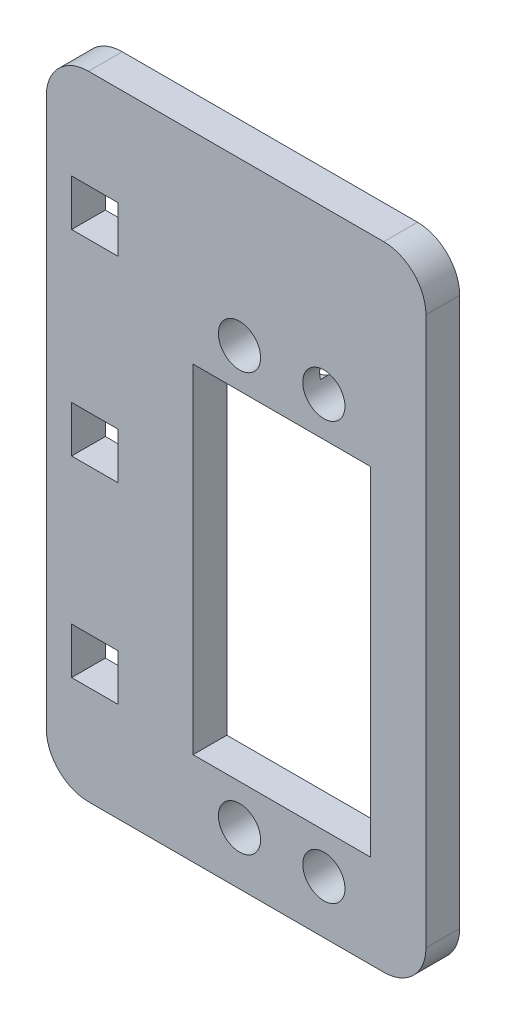
ISO-10303-21;
HEADER;
FILE_DESCRIPTION(('STEP AP214'),'2;1');
FILE_NAME('part.step','',(''),(''),'','','');
FILE_SCHEMA(('AUTOMOTIVE_DESIGN { 1 0 10303 214 1 1 1 1 }'));
ENDSEC;
DATA;
#1=APPLICATION_CONTEXT('core data for automotive mechanical design processes');
#2=APPLICATION_PROTOCOL_DEFINITION('international standard','automotive_design',2000,#1);
#3=PRODUCT_CONTEXT('',#1,'mechanical');
#4=PRODUCT('Part','Part','',(#3));
#5=PRODUCT_RELATED_PRODUCT_CATEGORY('part','',(#4));
#6=PRODUCT_DEFINITION_FORMATION('','',#4);
#7=PRODUCT_DEFINITION_CONTEXT('part definition',#1,'design');
#8=PRODUCT_DEFINITION('design','',#6,#7);
#9=PRODUCT_DEFINITION_SHAPE('','',#8);
#10=(LENGTH_UNIT() NAMED_UNIT(*) SI_UNIT(.MILLI.,.METRE.));
#11=(NAMED_UNIT(*) PLANE_ANGLE_UNIT() SI_UNIT($,.RADIAN.));
#12=(NAMED_UNIT(*) SI_UNIT($,.STERADIAN.) SOLID_ANGLE_UNIT());
#13=UNCERTAINTY_MEASURE_WITH_UNIT(LENGTH_MEASURE(1.E-05),#10,'distance_accuracy_value','');
#14=(GEOMETRIC_REPRESENTATION_CONTEXT(3) GLOBAL_UNCERTAINTY_ASSIGNED_CONTEXT((#13)) GLOBAL_UNIT_ASSIGNED_CONTEXT((#10,
#11,#12)) REPRESENTATION_CONTEXT('',''));
#15=CARTESIAN_POINT('',(0.,0.,0.));
#16=DIRECTION('',(0.,0.,1.));
#17=DIRECTION('',(1.,0.,0.));
#18=AXIS2_PLACEMENT_3D('',#15,#16,#17);
#19=CARTESIAN_POINT('',(0.,0.,0.));
#20=DIRECTION('',(0.,0.,1.));
#21=DIRECTION('',(1.,0.,0.));
#22=AXIS2_PLACEMENT_3D('',#19,#20,#21);
#23=PLANE('',#22);
#24=DIRECTION('',(0.,1.,0.));
#25=VECTOR('',#24,1.);
#26=CARTESIAN_POINT('',(-37.0142435960279,0.,0.));
#27=LINE('',#26,#25);
#28=CARTESIAN_POINT('',(-37.0142435960278,26.6641698890765,0.));
#29=VERTEX_POINT('',#28);
#30=CARTESIAN_POINT('',(-37.0142435960278,32.1641698890765,0.));
#31=VERTEX_POINT('',#30);
#32=EDGE_CURVE('E428',#29,#31,#27,.T.);
#33=ORIENTED_EDGE('',*,*,#32,.T.);
#34=DIRECTION('',(-1.,0.,0.));
#35=VECTOR('',#34,1.);
#36=CARTESIAN_POINT('',(0.,32.1641698890765,0.));
#37=LINE('',#36,#35);
#38=CARTESIAN_POINT('',(-42.5142435960278,32.1641698890765,0.));
#39=VERTEX_POINT('',#38);
#40=EDGE_CURVE('E441',#31,#39,#37,.T.);
#41=ORIENTED_EDGE('',*,*,#40,.T.);
#42=DIRECTION('',(0.,-1.,0.));
#43=VECTOR('',#42,1.);
#44=CARTESIAN_POINT('',(-42.5142435960279,0.,0.));
#45=LINE('',#44,#43);
#46=CARTESIAN_POINT('',(-42.5142435960278,26.6641698890765,0.));
#47=VERTEX_POINT('',#46);
#48=EDGE_CURVE('E453',#39,#47,#45,.T.);
#49=ORIENTED_EDGE('',*,*,#48,.T.);
#50=DIRECTION('',(1.,0.,0.));
#51=VECTOR('',#50,1.);
#52=CARTESIAN_POINT('',(0.,26.6641698890765,0.));
#53=LINE('',#52,#51);
#54=EDGE_CURVE('E452',#47,#29,#53,.T.);
#55=ORIENTED_EDGE('',*,*,#54,.T.);
#56=EDGE_LOOP('',(#33,#41,#49,#55));
#57=FACE_BOUND('',#56,.T.);
#58=DIRECTION('',(0.,1.,0.));
#59=VECTOR('',#58,1.);
#60=CARTESIAN_POINT('',(-42.5142435960278,0.,0.));
#61=LINE('',#60,#59);
#62=CARTESIAN_POINT('',(-42.5142435960278,3.41416988907649,0.));
#63=VERTEX_POINT('',#62);
#64=CARTESIAN_POINT('',(-42.5142435960278,8.91416988907649,0.));
#65=VERTEX_POINT('',#64);
#66=EDGE_CURVE('E411',#63,#65,#61,.T.);
#67=ORIENTED_EDGE('',*,*,#66,.F.);
#68=DIRECTION('',(-1.,0.,0.));
#69=VECTOR('',#68,1.);
#70=CARTESIAN_POINT('',(0.,3.41416988907649,0.));
#71=LINE('',#70,#69);
#72=CARTESIAN_POINT('',(-37.0142435960278,3.41416988907649,0.));
#73=VERTEX_POINT('',#72);
#74=EDGE_CURVE('E416',#73,#63,#71,.T.);
#75=ORIENTED_EDGE('',*,*,#74,.F.);
#76=DIRECTION('',(0.,-1.,0.));
#77=VECTOR('',#76,1.);
#78=CARTESIAN_POINT('',(-37.0142435960278,0.,0.));
#79=LINE('',#78,#77);
#80=CARTESIAN_POINT('',(-37.0142435960278,8.91416988907649,0.));
#81=VERTEX_POINT('',#80);
#82=EDGE_CURVE('E401',#81,#73,#79,.T.);
#83=ORIENTED_EDGE('',*,*,#82,.F.);
#84=DIRECTION('',(1.,0.,0.));
#85=VECTOR('',#84,1.);
#86=CARTESIAN_POINT('',(0.,8.91416988907648,0.));
#87=LINE('',#86,#85);
#88=EDGE_CURVE('E409',#65,#81,#87,.T.);
#89=ORIENTED_EDGE('',*,*,#88,.F.);
#90=EDGE_LOOP('',(#67,#75,#83,#89));
#91=FACE_BOUND('',#90,.T.);
#92=CARTESIAN_POINT('',(-22.6142435960278,-24.8008301109236,0.));
#93=DIRECTION('',(0.,0.,1.));
#94=DIRECTION('',(1.,0.,0.));
#95=AXIS2_PLACEMENT_3D('',#92,#93,#94);
#96=CIRCLE('',#95,2.50000000000002);
#97=CARTESIAN_POINT('',(-20.1142435960278,-24.8008301109236,0.));
#98=VERTEX_POINT('',#97);
#99=EDGE_CURVE('E332',#98,#98,#96,.T.);
#100=ORIENTED_EDGE('',*,*,#99,.T.);
#101=EDGE_LOOP('',(#100));
#102=FACE_BOUND('',#101,.T.);
#103=CARTESIAN_POINT('',(-12.6142435960278,-24.8008301109236,0.));
#104=DIRECTION('',(0.,0.,1.));
#105=DIRECTION('',(1.,0.,0.));
#106=AXIS2_PLACEMENT_3D('',#103,#104,#105);
#107=CIRCLE('',#106,2.50000000000002);
#108=CARTESIAN_POINT('',(-10.1142435960278,-24.8008301109236,0.));
#109=VERTEX_POINT('',#108);
#110=EDGE_CURVE('E328',#109,#109,#107,.T.);
#111=ORIENTED_EDGE('',*,*,#110,.T.);
#112=EDGE_LOOP('',(#111));
#113=FACE_BOUND('',#112,.T.);
#114=DIRECTION('',(0.,-1.,0.));
#115=VECTOR('',#114,1.);
#116=CARTESIAN_POINT('',(-45.5142435960278,43.9141698890765,0.));
#117=LINE('',#116,#115);
#118=CARTESIAN_POINT('',(-45.5142435960278,38.9141698890765,0.));
#119=VERTEX_POINT('',#118);
#120=CARTESIAN_POINT('',(-45.5142435960278,-26.0858301109235,0.));
#121=VERTEX_POINT('',#120);
#122=EDGE_CURVE('E265',#119,#121,#117,.T.);
#123=ORIENTED_EDGE('',*,*,#122,.F.);
#124=CARTESIAN_POINT('',(-40.5142435960278,38.9141698890765,0.));
#125=DIRECTION('',(0.,0.,1.));
#126=DIRECTION('',(1.,0.,0.));
#127=AXIS2_PLACEMENT_3D('',#124,#125,#126);
#128=CIRCLE('',#127,5.);
#129=CARTESIAN_POINT('',(-40.5142435960278,43.9141698890765,0.));
#130=VERTEX_POINT('',#129);
#131=EDGE_CURVE('E288',#119,#130,#128,.F.);
#132=ORIENTED_EDGE('',*,*,#131,.T.);
#133=DIRECTION('',(-1.,0.,0.));
#134=VECTOR('',#133,1.);
#135=CARTESIAN_POINT('',(-30.5142435960278,43.9141698890765,0.));
#136=LINE('',#135,#134);
#137=CARTESIAN_POINT('',(-5.51424359602781,43.9141698890765,0.));
#138=VERTEX_POINT('',#137);
#139=EDGE_CURVE('E274',#138,#130,#136,.T.);
#140=ORIENTED_EDGE('',*,*,#139,.F.);
#141=CARTESIAN_POINT('',(-5.51424359602781,38.9141698890765,0.));
#142=DIRECTION('',(0.,0.,1.));
#143=DIRECTION('',(1.,0.,0.));
#144=AXIS2_PLACEMENT_3D('',#141,#142,#143);
#145=CIRCLE('',#144,5.);
#146=CARTESIAN_POINT('',(-0.514243596027808,38.9141698890765,0.));
#147=VERTEX_POINT('',#146);
#148=EDGE_CURVE('E281',#138,#147,#145,.F.);
#149=ORIENTED_EDGE('',*,*,#148,.T.);
#150=DIRECTION('',(0.,1.,0.));
#151=VECTOR('',#150,1.);
#152=CARTESIAN_POINT('',(-0.514243596027808,-31.0858301109235,0.));
#153=LINE('',#152,#151);
#154=CARTESIAN_POINT('',(-0.514243596027808,-26.0858301109235,0.));
#155=VERTEX_POINT('',#154);
#156=EDGE_CURVE('E273',#155,#147,#153,.T.);
#157=ORIENTED_EDGE('',*,*,#156,.F.);
#158=CARTESIAN_POINT('',(-5.51424359602781,-26.0858301109235,0.));
#159=DIRECTION('',(0.,0.,1.));
#160=DIRECTION('',(1.,0.,0.));
#161=AXIS2_PLACEMENT_3D('',#158,#159,#160);
#162=CIRCLE('',#161,5.);
#163=CARTESIAN_POINT('',(-5.51424359602781,-31.0858301109235,0.));
#164=VERTEX_POINT('',#163);
#165=EDGE_CURVE('E287',#155,#164,#162,.F.);
#166=ORIENTED_EDGE('',*,*,#165,.T.);
#167=DIRECTION('',(1.,0.,0.));
#168=VECTOR('',#167,1.);
#169=CARTESIAN_POINT('',(-30.5142435960278,-31.0858301109235,0.));
#170=LINE('',#169,#168);
#171=CARTESIAN_POINT('',(-40.5142435960278,-31.0858301109235,0.));
#172=VERTEX_POINT('',#171);
#173=EDGE_CURVE('E255',#172,#164,#170,.T.);
#174=ORIENTED_EDGE('',*,*,#173,.F.);
#175=CARTESIAN_POINT('',(-40.5142435960278,-26.0858301109235,0.));
#176=DIRECTION('',(0.,0.,1.));
#177=DIRECTION('',(1.,0.,0.));
#178=AXIS2_PLACEMENT_3D('',#175,#176,#177);
#179=CIRCLE('',#178,5.);
#180=EDGE_CURVE('E289',#172,#121,#179,.F.);
#181=ORIENTED_EDGE('',*,*,#180,.T.);
#182=EDGE_LOOP('',(#123,#132,#140,#149,#157,#166,#174,#181));
#183=FACE_BOUND('',#182,.T.);
#184=DIRECTION('',(1.,0.,0.));
#185=VECTOR('',#184,1.);
#186=CARTESIAN_POINT('',(-7.11424359602785,-20.0508301109236,0.));
#187=LINE('',#186,#185);
#188=CARTESIAN_POINT('',(-28.1142435960282,-20.0508301109236,0.));
#189=VERTEX_POINT('',#188);
#190=CARTESIAN_POINT('',(-7.11424359602785,-20.0508301109236,0.));
#191=VERTEX_POINT('',#190);
#192=EDGE_CURVE('E359',#189,#191,#187,.T.);
#193=ORIENTED_EDGE('',*,*,#192,.T.);
#194=DIRECTION('',(0.,1.,0.));
#195=VECTOR('',#194,1.);
#196=CARTESIAN_POINT('',(-7.11424359602785,-20.0508301109236,0.));
#197=LINE('',#196,#195);
#198=CARTESIAN_POINT('',(-7.11424359602785,20.0491698890765,0.));
#199=VERTEX_POINT('',#198);
#200=EDGE_CURVE('E354',#191,#199,#197,.T.);
#201=ORIENTED_EDGE('',*,*,#200,.T.);
#202=DIRECTION('',(-1.,0.,0.));
#203=VECTOR('',#202,1.);
#204=CARTESIAN_POINT('',(-7.11424359602785,20.0491698890765,0.));
#205=LINE('',#204,#203);
#206=CARTESIAN_POINT('',(-28.1142435960282,20.0491698890764,0.));
#207=VERTEX_POINT('',#206);
#208=EDGE_CURVE('E355',#199,#207,#205,.T.);
#209=ORIENTED_EDGE('',*,*,#208,.T.);
#210=DIRECTION('',(0.,-1.,0.));
#211=VECTOR('',#210,1.);
#212=CARTESIAN_POINT('',(-28.1142435960282,20.0491698890764,0.));
#213=LINE('',#212,#211);
#214=EDGE_CURVE('E348',#207,#189,#213,.T.);
#215=ORIENTED_EDGE('',*,*,#214,.T.);
#216=EDGE_LOOP('',(#193,#201,#209,#215));
#217=FACE_BOUND('',#216,.T.);
#218=DIRECTION('',(0.,-1.,0.));
#219=VECTOR('',#218,1.);
#220=CARTESIAN_POINT('',(-37.0142435960278,0.,0.));
#221=LINE('',#220,#219);
#222=CARTESIAN_POINT('',(-37.0142435960278,-13.8358301109235,0.));
#223=VERTEX_POINT('',#222);
#224=CARTESIAN_POINT('',(-37.0142435960278,-19.3358301109235,0.));
#225=VERTEX_POINT('',#224);
#226=EDGE_CURVE('E433',#223,#225,#221,.T.);
#227=ORIENTED_EDGE('',*,*,#226,.F.);
#228=DIRECTION('',(1.,0.,0.));
#229=VECTOR('',#228,1.);
#230=CARTESIAN_POINT('',(0.,-13.8358301109235,0.));
#231=LINE('',#230,#229);
#232=CARTESIAN_POINT('',(-42.5142435960278,-13.8358301109235,0.));
#233=VERTEX_POINT('',#232);
#234=EDGE_CURVE('E439',#233,#223,#231,.T.);
#235=ORIENTED_EDGE('',*,*,#234,.F.);
#236=DIRECTION('',(0.,1.,0.));
#237=VECTOR('',#236,1.);
#238=CARTESIAN_POINT('',(-42.5142435960278,0.,0.));
#239=LINE('',#238,#237);
#240=CARTESIAN_POINT('',(-42.5142435960278,-19.3358301109235,0.));
#241=VERTEX_POINT('',#240);
#242=EDGE_CURVE('E423',#241,#233,#239,.T.);
#243=ORIENTED_EDGE('',*,*,#242,.F.);
#244=DIRECTION('',(-1.,0.,0.));
#245=VECTOR('',#244,1.);
#246=CARTESIAN_POINT('',(0.,-19.3358301109235,0.));
#247=LINE('',#246,#245);
#248=EDGE_CURVE('E435',#225,#241,#247,.T.);
#249=ORIENTED_EDGE('',*,*,#248,.F.);
#250=EDGE_LOOP('',(#227,#235,#243,#249));
#251=FACE_BOUND('',#250,.T.);
#252=CARTESIAN_POINT('',(-17.6142435960278,25.5041698890765,0.));
#253=DIRECTION('',(0.,0.,-1.));
#254=DIRECTION('',(-1.,0.,0.));
#255=AXIS2_PLACEMENT_3D('',#252,#253,#254);
#256=CIRCLE('',#255,3.);
#257=CARTESIAN_POINT('',(-20.5519572194251,26.1123135126608,0.));
#258=VERTEX_POINT('',#257);
#259=CARTESIAN_POINT('',(-14.6765299726307,26.1123135126616,0.));
#260=VERTEX_POINT('',#259);
#261=EDGE_CURVE('E230',#258,#260,#256,.T.);
#262=ORIENTED_EDGE('',*,*,#261,.F.);
#263=CARTESIAN_POINT('',(-22.6142435960282,24.6991698890764,0.));
#264=DIRECTION('',(0.,0.,1.));
#265=DIRECTION('',(1.,0.,0.));
#266=AXIS2_PLACEMENT_3D('',#263,#264,#265);
#267=CIRCLE('',#266,2.50000000000001);
#268=CARTESIAN_POINT('',(-20.2126336297351,24.0047135766983,0.));
#269=VERTEX_POINT('',#268);
#270=EDGE_CURVE('E236',#258,#269,#267,.T.);
#271=ORIENTED_EDGE('',*,*,#270,.T.);
#272=CARTESIAN_POINT('',(-15.015853562321,24.0047135766976,0.));
#273=VERTEX_POINT('',#272);
#274=EDGE_CURVE('E244',#273,#269,#256,.T.);
#275=ORIENTED_EDGE('',*,*,#274,.F.);
#276=CARTESIAN_POINT('',(-12.6142435960282,24.6991698890765,0.));
#277=DIRECTION('',(0.,0.,1.));
#278=DIRECTION('',(1.,0.,0.));
#279=AXIS2_PLACEMENT_3D('',#276,#277,#278);
#280=CIRCLE('',#279,2.5);
#281=EDGE_CURVE('E242',#273,#260,#280,.T.);
#282=ORIENTED_EDGE('',*,*,#281,.T.);
#283=EDGE_LOOP('',(#262,#271,#275,#282));
#284=FACE_BOUND('',#283,.T.);
#285=ADVANCED_FACE('F39',(#57,#91,#102,#113,#183,#217,#251,#284),#23,.F.);
#286=CARTESIAN_POINT('',(0.,0.,4.));
#287=DIRECTION('',(0.,0.,1.));
#288=DIRECTION('',(1.,0.,0.));
#289=AXIS2_PLACEMENT_3D('',#286,#287,#288);
#290=PLANE('',#289);
#291=DIRECTION('',(-1.,0.,0.));
#292=VECTOR('',#291,1.);
#293=CARTESIAN_POINT('',(0.,-13.8358301109235,4.));
#294=LINE('',#293,#292);
#295=CARTESIAN_POINT('',(-37.0142435960278,-13.8358301109235,4.));
#296=VERTEX_POINT('',#295);
#297=CARTESIAN_POINT('',(-42.5142435960278,-13.8358301109235,4.));
#298=VERTEX_POINT('',#297);
#299=EDGE_CURVE('E362',#296,#298,#294,.T.);
#300=ORIENTED_EDGE('',*,*,#299,.F.);
#301=DIRECTION('',(0.,1.,0.));
#302=VECTOR('',#301,1.);
#303=CARTESIAN_POINT('',(-37.0142435960278,0.,4.));
#304=LINE('',#303,#302);
#305=CARTESIAN_POINT('',(-37.0142435960278,-19.3358301109235,4.));
#306=VERTEX_POINT('',#305);
#307=EDGE_CURVE('E373',#306,#296,#304,.T.);
#308=ORIENTED_EDGE('',*,*,#307,.F.);
#309=DIRECTION('',(1.,0.,0.));
#310=VECTOR('',#309,1.);
#311=CARTESIAN_POINT('',(0.,-19.3358301109235,4.));
#312=LINE('',#311,#310);
#313=CARTESIAN_POINT('',(-42.5142435960278,-19.3358301109235,4.));
#314=VERTEX_POINT('',#313);
#315=EDGE_CURVE('E375',#314,#306,#312,.T.);
#316=ORIENTED_EDGE('',*,*,#315,.F.);
#317=DIRECTION('',(0.,-1.,0.));
#318=VECTOR('',#317,1.);
#319=CARTESIAN_POINT('',(-42.5142435960278,0.,4.));
#320=LINE('',#319,#318);
#321=EDGE_CURVE('E368',#298,#314,#320,.T.);
#322=ORIENTED_EDGE('',*,*,#321,.F.);
#323=EDGE_LOOP('',(#300,#308,#316,#322));
#324=FACE_BOUND('',#323,.T.);
#325=DIRECTION('',(1.,0.,0.));
#326=VECTOR('',#325,1.);
#327=CARTESIAN_POINT('',(0.,3.41416988907649,4.));
#328=LINE('',#327,#326);
#329=CARTESIAN_POINT('',(-42.5142435960278,3.41416988907649,4.));
#330=VERTEX_POINT('',#329);
#331=CARTESIAN_POINT('',(-37.0142435960278,3.41416988907649,4.));
#332=VERTEX_POINT('',#331);
#333=EDGE_CURVE('E386',#330,#332,#328,.T.);
#334=ORIENTED_EDGE('',*,*,#333,.F.);
#335=DIRECTION('',(0.,-1.,0.));
#336=VECTOR('',#335,1.);
#337=CARTESIAN_POINT('',(-42.5142435960278,0.,4.));
#338=LINE('',#337,#336);
#339=CARTESIAN_POINT('',(-42.5142435960278,8.91416988907649,4.));
#340=VERTEX_POINT('',#339);
#341=EDGE_CURVE('E397',#340,#330,#338,.T.);
#342=ORIENTED_EDGE('',*,*,#341,.F.);
#343=DIRECTION('',(-1.,0.,0.));
#344=VECTOR('',#343,1.);
#345=CARTESIAN_POINT('',(0.,8.91416988907648,4.));
#346=LINE('',#345,#344);
#347=CARTESIAN_POINT('',(-37.0142435960278,8.91416988907649,4.));
#348=VERTEX_POINT('',#347);
#349=EDGE_CURVE('E394',#348,#340,#346,.T.);
#350=ORIENTED_EDGE('',*,*,#349,.F.);
#351=DIRECTION('',(0.,1.,0.));
#352=VECTOR('',#351,1.);
#353=CARTESIAN_POINT('',(-37.0142435960278,0.,4.));
#354=LINE('',#353,#352);
#355=EDGE_CURVE('E392',#332,#348,#354,.T.);
#356=ORIENTED_EDGE('',*,*,#355,.F.);
#357=EDGE_LOOP('',(#334,#342,#350,#356));
#358=FACE_BOUND('',#357,.T.);
#359=CARTESIAN_POINT('',(-12.6142435960278,-24.8008301109236,4.));
#360=DIRECTION('',(0.,0.,1.));
#361=DIRECTION('',(1.,0.,0.));
#362=AXIS2_PLACEMENT_3D('',#359,#360,#361);
#363=CIRCLE('',#362,2.50000000000002);
#364=CARTESIAN_POINT('',(-10.1142435960278,-24.8008301109236,4.));
#365=VERTEX_POINT('',#364);
#366=EDGE_CURVE('E321',#365,#365,#363,.T.);
#367=ORIENTED_EDGE('',*,*,#366,.F.);
#368=EDGE_LOOP('',(#367));
#369=FACE_BOUND('',#368,.T.);
#370=CARTESIAN_POINT('',(-22.6142435960282,24.6991698890764,4.));
#371=DIRECTION('',(0.,0.,1.));
#372=DIRECTION('',(1.,0.,0.));
#373=AXIS2_PLACEMENT_3D('',#370,#371,#372);
#374=CIRCLE('',#373,2.50000000000001);
#375=CARTESIAN_POINT('',(-20.1142435960282,24.6991698890764,4.));
#376=VERTEX_POINT('',#375);
#377=EDGE_CURVE('E249',#376,#376,#374,.T.);
#378=ORIENTED_EDGE('',*,*,#377,.F.);
#379=EDGE_LOOP('',(#378));
#380=FACE_BOUND('',#379,.T.);
#381=DIRECTION('',(-1.,0.,0.));
#382=VECTOR('',#381,1.);
#383=CARTESIAN_POINT('',(-0.514243596027808,43.9141698890765,4.));
#384=LINE('',#383,#382);
#385=CARTESIAN_POINT('',(-5.51424359602781,43.9141698890765,4.));
#386=VERTEX_POINT('',#385);
#387=CARTESIAN_POINT('',(-40.5142435960278,43.9141698890765,4.));
#388=VERTEX_POINT('',#387);
#389=EDGE_CURVE('E264',#386,#388,#384,.T.);
#390=ORIENTED_EDGE('',*,*,#389,.T.);
#391=CARTESIAN_POINT('',(-40.5142435960278,38.9141698890765,4.));
#392=DIRECTION('',(0.,0.,1.));
#393=DIRECTION('',(1.,0.,0.));
#394=AXIS2_PLACEMENT_3D('',#391,#392,#393);
#395=CIRCLE('',#394,5.);
#396=CARTESIAN_POINT('',(-45.5142435960278,38.9141698890765,4.));
#397=VERTEX_POINT('',#396);
#398=EDGE_CURVE('E301',#388,#397,#395,.T.);
#399=ORIENTED_EDGE('',*,*,#398,.T.);
#400=DIRECTION('',(0.,-1.,0.));
#401=VECTOR('',#400,1.);
#402=CARTESIAN_POINT('',(-45.5142435960278,43.9141698890765,4.));
#403=LINE('',#402,#401);
#404=CARTESIAN_POINT('',(-45.5142435960278,-26.0858301109235,4.));
#405=VERTEX_POINT('',#404);
#406=EDGE_CURVE('E270',#397,#405,#403,.T.);
#407=ORIENTED_EDGE('',*,*,#406,.T.);
#408=CARTESIAN_POINT('',(-40.5142435960278,-26.0858301109235,4.));
#409=DIRECTION('',(0.,0.,1.));
#410=DIRECTION('',(1.,0.,0.));
#411=AXIS2_PLACEMENT_3D('',#408,#409,#410);
#412=CIRCLE('',#411,5.);
#413=CARTESIAN_POINT('',(-40.5142435960278,-31.0858301109235,4.));
#414=VERTEX_POINT('',#413);
#415=EDGE_CURVE('E303',#405,#414,#412,.T.);
#416=ORIENTED_EDGE('',*,*,#415,.T.);
#417=DIRECTION('',(1.,0.,0.));
#418=VECTOR('',#417,1.);
#419=CARTESIAN_POINT('',(-30.5142435960278,-31.0858301109235,4.));
#420=LINE('',#419,#418);
#421=CARTESIAN_POINT('',(-5.51424359602781,-31.0858301109235,4.));
#422=VERTEX_POINT('',#421);
#423=EDGE_CURVE('E256',#414,#422,#420,.T.);
#424=ORIENTED_EDGE('',*,*,#423,.T.);
#425=CARTESIAN_POINT('',(-5.51424359602781,-26.0858301109235,4.));
#426=DIRECTION('',(0.,0.,1.));
#427=DIRECTION('',(1.,0.,0.));
#428=AXIS2_PLACEMENT_3D('',#425,#426,#427);
#429=CIRCLE('',#428,5.);
#430=CARTESIAN_POINT('',(-0.514243596027808,-26.0858301109235,4.));
#431=VERTEX_POINT('',#430);
#432=EDGE_CURVE('E296',#422,#431,#429,.T.);
#433=ORIENTED_EDGE('',*,*,#432,.T.);
#434=DIRECTION('',(0.,1.,0.));
#435=VECTOR('',#434,1.);
#436=CARTESIAN_POINT('',(-0.514243596027808,-31.0858301109235,4.));
#437=LINE('',#436,#435);
#438=CARTESIAN_POINT('',(-0.514243596027808,38.9141698890765,4.));
#439=VERTEX_POINT('',#438);
#440=EDGE_CURVE('E263',#431,#439,#437,.T.);
#441=ORIENTED_EDGE('',*,*,#440,.T.);
#442=CARTESIAN_POINT('',(-5.51424359602781,38.9141698890765,4.));
#443=DIRECTION('',(0.,0.,1.));
#444=DIRECTION('',(1.,0.,0.));
#445=AXIS2_PLACEMENT_3D('',#442,#443,#444);
#446=CIRCLE('',#445,5.);
#447=EDGE_CURVE('E300',#439,#386,#446,.T.);
#448=ORIENTED_EDGE('',*,*,#447,.T.);
#449=EDGE_LOOP('',(#390,#399,#407,#416,#424,#433,#441,#448));
#450=FACE_BOUND('',#449,.T.);
#451=CARTESIAN_POINT('',(-12.6142435960282,24.6991698890765,4.));
#452=DIRECTION('',(0.,0.,1.));
#453=DIRECTION('',(1.,0.,0.));
#454=AXIS2_PLACEMENT_3D('',#451,#452,#453);
#455=CIRCLE('',#454,2.5);
#456=CARTESIAN_POINT('',(-10.1142435960282,24.6991698890765,4.));
#457=VERTEX_POINT('',#456);
#458=EDGE_CURVE('E246',#457,#457,#455,.T.);
#459=ORIENTED_EDGE('',*,*,#458,.F.);
#460=EDGE_LOOP('',(#459));
#461=FACE_BOUND('',#460,.T.);
#462=CARTESIAN_POINT('',(-22.6142435960278,-24.8008301109236,4.));
#463=DIRECTION('',(0.,0.,1.));
#464=DIRECTION('',(1.,0.,0.));
#465=AXIS2_PLACEMENT_3D('',#462,#463,#464);
#466=CIRCLE('',#465,2.50000000000002);
#467=CARTESIAN_POINT('',(-20.1142435960278,-24.8008301109236,4.));
#468=VERTEX_POINT('',#467);
#469=EDGE_CURVE('E329',#468,#468,#466,.T.);
#470=ORIENTED_EDGE('',*,*,#469,.F.);
#471=EDGE_LOOP('',(#470));
#472=FACE_BOUND('',#471,.T.);
#473=DIRECTION('',(0.,1.,0.));
#474=VECTOR('',#473,1.);
#475=CARTESIAN_POINT('',(-7.11424359602785,-20.0508301109236,4.));
#476=LINE('',#475,#474);
#477=CARTESIAN_POINT('',(-7.11424359602785,-20.0508301109236,4.));
#478=VERTEX_POINT('',#477);
#479=CARTESIAN_POINT('',(-7.11424359602785,20.0491698890765,4.));
#480=VERTEX_POINT('',#479);
#481=EDGE_CURVE('E367',#478,#480,#476,.T.);
#482=ORIENTED_EDGE('',*,*,#481,.F.);
#483=DIRECTION('',(1.,0.,0.));
#484=VECTOR('',#483,1.);
#485=CARTESIAN_POINT('',(-7.11424359602785,-20.0508301109236,4.));
#486=LINE('',#485,#484);
#487=CARTESIAN_POINT('',(-28.1142435960282,-20.0508301109236,4.));
#488=VERTEX_POINT('',#487);
#489=EDGE_CURVE('E351',#488,#478,#486,.T.);
#490=ORIENTED_EDGE('',*,*,#489,.F.);
#491=DIRECTION('',(0.,-1.,0.));
#492=VECTOR('',#491,1.);
#493=CARTESIAN_POINT('',(-28.1142435960282,20.0491698890764,4.));
#494=LINE('',#493,#492);
#495=CARTESIAN_POINT('',(-28.1142435960282,20.0491698890764,4.));
#496=VERTEX_POINT('',#495);
#497=EDGE_CURVE('E350',#496,#488,#494,.T.);
#498=ORIENTED_EDGE('',*,*,#497,.F.);
#499=DIRECTION('',(-1.,0.,0.));
#500=VECTOR('',#499,1.);
#501=CARTESIAN_POINT('',(-7.11424359602785,20.0491698890765,4.));
#502=LINE('',#501,#500);
#503=EDGE_CURVE('E364',#480,#496,#502,.T.);
#504=ORIENTED_EDGE('',*,*,#503,.F.);
#505=EDGE_LOOP('',(#482,#490,#498,#504));
#506=FACE_BOUND('',#505,.T.);
#507=DIRECTION('',(1.,0.,0.));
#508=VECTOR('',#507,1.);
#509=CARTESIAN_POINT('',(0.,32.1641698890765,4.));
#510=LINE('',#509,#508);
#511=CARTESIAN_POINT('',(-42.5142435960278,32.1641698890765,4.));
#512=VERTEX_POINT('',#511);
#513=CARTESIAN_POINT('',(-37.0142435960278,32.1641698890765,4.));
#514=VERTEX_POINT('',#513);
#515=EDGE_CURVE('E379',#512,#514,#510,.T.);
#516=ORIENTED_EDGE('',*,*,#515,.T.);
#517=DIRECTION('',(0.,-1.,0.));
#518=VECTOR('',#517,1.);
#519=CARTESIAN_POINT('',(-37.0142435960279,0.,4.));
#520=LINE('',#519,#518);
#521=CARTESIAN_POINT('',(-37.0142435960278,26.6641698890765,4.));
#522=VERTEX_POINT('',#521);
#523=EDGE_CURVE('E380',#514,#522,#520,.T.);
#524=ORIENTED_EDGE('',*,*,#523,.T.);
#525=DIRECTION('',(-1.,0.,0.));
#526=VECTOR('',#525,1.);
#527=CARTESIAN_POINT('',(0.,26.6641698890765,4.));
#528=LINE('',#527,#526);
#529=CARTESIAN_POINT('',(-42.5142435960278,26.6641698890765,4.));
#530=VERTEX_POINT('',#529);
#531=EDGE_CURVE('E387',#522,#530,#528,.T.);
#532=ORIENTED_EDGE('',*,*,#531,.T.);
#533=DIRECTION('',(0.,1.,0.));
#534=VECTOR('',#533,1.);
#535=CARTESIAN_POINT('',(-42.5142435960279,0.,4.));
#536=LINE('',#535,#534);
#537=EDGE_CURVE('E381',#530,#512,#536,.T.);
#538=ORIENTED_EDGE('',*,*,#537,.T.);
#539=EDGE_LOOP('',(#516,#524,#532,#538));
#540=FACE_BOUND('',#539,.T.);
#541=ADVANCED_FACE('F466',(#324,#358,#369,#380,#450,#461,#472,#506,#540),#290,.T.);
#542=CARTESIAN_POINT('',(-30.5142435960278,-31.0858301109235,4.));
#543=DIRECTION('',(0.,1.,0.));
#544=DIRECTION('',(-1.,0.,0.));
#545=AXIS2_PLACEMENT_3D('',#542,#543,#544);
#546=PLANE('',#545);
#547=ORIENTED_EDGE('',*,*,#423,.F.);
#548=DIRECTION('',(0.,0.,-1.));
#549=VECTOR('',#548,1.);
#550=CARTESIAN_POINT('',(-40.5142435960278,-31.0858301109235,4.));
#551=LINE('',#550,#549);
#552=EDGE_CURVE('E310',#414,#172,#551,.T.);
#553=ORIENTED_EDGE('',*,*,#552,.T.);
#554=ORIENTED_EDGE('',*,*,#173,.T.);
#555=DIRECTION('',(0.,0.,-1.));
#556=VECTOR('',#555,1.);
#557=CARTESIAN_POINT('',(-5.51424359602781,-31.0858301109235,4.));
#558=LINE('',#557,#556);
#559=EDGE_CURVE('E304',#164,#422,#558,.F.);
#560=ORIENTED_EDGE('',*,*,#559,.T.);
#561=EDGE_LOOP('',(#547,#553,#554,#560));
#562=FACE_BOUND('',#561,.T.);
#563=ADVANCED_FACE('F480',(#562),#546,.F.);
#564=CARTESIAN_POINT('',(-0.514243596027808,-31.0858301109235,4.));
#565=DIRECTION('',(-1.,0.,0.));
#566=DIRECTION('',(0.,0.,1.));
#567=AXIS2_PLACEMENT_3D('',#564,#565,#566);
#568=PLANE('',#567);
#569=ORIENTED_EDGE('',*,*,#440,.F.);
#570=DIRECTION('',(0.,0.,-1.));
#571=VECTOR('',#570,1.);
#572=CARTESIAN_POINT('',(-0.514243596027808,-26.0858301109235,4.));
#573=LINE('',#572,#571);
#574=EDGE_CURVE('E312',#431,#155,#573,.T.);
#575=ORIENTED_EDGE('',*,*,#574,.T.);
#576=ORIENTED_EDGE('',*,*,#156,.T.);
#577=DIRECTION('',(0.,0.,-1.));
#578=VECTOR('',#577,1.);
#579=CARTESIAN_POINT('',(-0.514243596027808,38.9141698890765,4.));
#580=LINE('',#579,#578);
#581=EDGE_CURVE('E62',#147,#439,#580,.F.);
#582=ORIENTED_EDGE('',*,*,#581,.T.);
#583=EDGE_LOOP('',(#569,#575,#576,#582));
#584=FACE_BOUND('',#583,.T.);
#585=ADVANCED_FACE('F487',(#584),#568,.F.);
#586=CARTESIAN_POINT('',(-30.5142435960278,43.9141698890765,4.));
#587=DIRECTION('',(0.,-1.,0.));
#588=DIRECTION('',(0.,0.,-1.));
#589=AXIS2_PLACEMENT_3D('',#586,#587,#588);
#590=PLANE('',#589);
#591=ORIENTED_EDGE('',*,*,#139,.T.);
#592=DIRECTION('',(0.,0.,-1.));
#593=VECTOR('',#592,1.);
#594=CARTESIAN_POINT('',(-40.5142435960278,43.9141698890765,4.));
#595=LINE('',#594,#593);
#596=EDGE_CURVE('E293',#130,#388,#595,.F.);
#597=ORIENTED_EDGE('',*,*,#596,.T.);
#598=ORIENTED_EDGE('',*,*,#389,.F.);
#599=DIRECTION('',(0.,0.,-1.));
#600=VECTOR('',#599,1.);
#601=CARTESIAN_POINT('',(-5.51424359602781,43.9141698890765,4.));
#602=LINE('',#601,#600);
#603=EDGE_CURVE('E295',#386,#138,#602,.T.);
#604=ORIENTED_EDGE('',*,*,#603,.T.);
#605=EDGE_LOOP('',(#591,#597,#598,#604));
#606=FACE_BOUND('',#605,.T.);
#607=ADVANCED_FACE('F488',(#606),#590,.F.);
#608=CARTESIAN_POINT('',(-45.5142435960278,43.9141698890765,4.));
#609=DIRECTION('',(1.,0.,0.));
#610=DIRECTION('',(0.,1.,0.));
#611=AXIS2_PLACEMENT_3D('',#608,#609,#610);
#612=PLANE('',#611);
#613=ORIENTED_EDGE('',*,*,#406,.F.);
#614=DIRECTION('',(0.,0.,-1.));
#615=VECTOR('',#614,1.);
#616=CARTESIAN_POINT('',(-45.5142435960278,38.9141698890765,4.));
#617=LINE('',#616,#615);
#618=EDGE_CURVE('E282',#397,#119,#617,.T.);
#619=ORIENTED_EDGE('',*,*,#618,.T.);
#620=ORIENTED_EDGE('',*,*,#122,.T.);
#621=DIRECTION('',(0.,0.,-1.));
#622=VECTOR('',#621,1.);
#623=CARTESIAN_POINT('',(-45.5142435960278,-26.0858301109235,4.));
#624=LINE('',#623,#622);
#625=EDGE_CURVE('E269',#121,#405,#624,.F.);
#626=ORIENTED_EDGE('',*,*,#625,.T.);
#627=EDGE_LOOP('',(#613,#619,#620,#626));
#628=FACE_BOUND('',#627,.T.);
#629=ADVANCED_FACE('F481',(#628),#612,.F.);
#630=CARTESIAN_POINT('',(-22.6142435960282,24.6991698890764,4.));
#631=DIRECTION('',(0.,0.,-1.));
#632=DIRECTION('',(-1.,0.,0.));
#633=AXIS2_PLACEMENT_3D('',#630,#631,#632);
#634=CYLINDRICAL_SURFACE('',#633,2.50000000000001);
#635=DIRECTION('',(0.,0.,-1.));
#636=VECTOR('',#635,1.);
#637=CARTESIAN_POINT('',(-20.2126336297351,24.0047135766983,1.));
#638=LINE('',#637,#636);
#639=CARTESIAN_POINT('',(-20.2126336297351,24.0047135766983,2.));
#640=VERTEX_POINT('',#639);
#641=EDGE_CURVE('E235',#269,#640,#638,.F.);
#642=ORIENTED_EDGE('',*,*,#641,.F.);
#643=ORIENTED_EDGE('',*,*,#270,.F.);
#644=DIRECTION('',(0.,0.,-1.));
#645=VECTOR('',#644,1.);
#646=CARTESIAN_POINT('',(-20.5519572194251,26.1123135126608,1.));
#647=LINE('',#646,#645);
#648=CARTESIAN_POINT('',(-20.5519572194251,26.1123135126608,2.));
#649=VERTEX_POINT('',#648);
#650=EDGE_CURVE('E221',#649,#258,#647,.T.);
#651=ORIENTED_EDGE('',*,*,#650,.F.);
#652=CARTESIAN_POINT('',(-22.6142435960282,24.6991698890764,2.));
#653=DIRECTION('',(0.,0.,-1.));
#654=DIRECTION('',(-1.,0.,0.));
#655=AXIS2_PLACEMENT_3D('',#652,#653,#654);
#656=CIRCLE('',#655,2.50000000000001);
#657=EDGE_CURVE('E231',#649,#640,#656,.T.);
#658=ORIENTED_EDGE('',*,*,#657,.T.);
#659=EDGE_LOOP('',(#642,#643,#651,#658));
#660=FACE_BOUND('',#659,.T.);
#661=ORIENTED_EDGE('',*,*,#377,.T.);
#662=EDGE_LOOP('',(#661));
#663=FACE_BOUND('',#662,.T.);
#664=ADVANCED_FACE('F247',(#660,#663),#634,.F.);
#665=CARTESIAN_POINT('',(-12.6142435960282,24.6991698890765,4.));
#666=DIRECTION('',(0.,0.,-1.));
#667=DIRECTION('',(-1.,0.,0.));
#668=AXIS2_PLACEMENT_3D('',#665,#666,#667);
#669=CYLINDRICAL_SURFACE('',#668,2.5);
#670=DIRECTION('',(0.,0.,-1.));
#671=VECTOR('',#670,1.);
#672=CARTESIAN_POINT('',(-14.6765299726307,26.1123135126616,1.));
#673=LINE('',#672,#671);
#674=CARTESIAN_POINT('',(-14.6765299726307,26.1123135126616,2.));
#675=VERTEX_POINT('',#674);
#676=EDGE_CURVE('E11',#260,#675,#673,.F.);
#677=ORIENTED_EDGE('',*,*,#676,.F.);
#678=ORIENTED_EDGE('',*,*,#281,.F.);
#679=DIRECTION('',(0.,0.,-1.));
#680=VECTOR('',#679,1.);
#681=CARTESIAN_POINT('',(-15.015853562321,24.0047135766976,1.));
#682=LINE('',#681,#680);
#683=CARTESIAN_POINT('',(-15.015853562321,24.0047135766976,2.));
#684=VERTEX_POINT('',#683);
#685=EDGE_CURVE('E50',#684,#273,#682,.T.);
#686=ORIENTED_EDGE('',*,*,#685,.F.);
#687=CARTESIAN_POINT('',(-12.6142435960282,24.6991698890765,2.));
#688=DIRECTION('',(0.,0.,-1.));
#689=DIRECTION('',(-1.,0.,0.));
#690=AXIS2_PLACEMENT_3D('',#687,#688,#689);
#691=CIRCLE('',#690,2.5);
#692=EDGE_CURVE('E311',#684,#675,#691,.T.);
#693=ORIENTED_EDGE('',*,*,#692,.T.);
#694=EDGE_LOOP('',(#677,#678,#686,#693));
#695=FACE_BOUND('',#694,.T.);
#696=ORIENTED_EDGE('',*,*,#458,.T.);
#697=EDGE_LOOP('',(#696));
#698=FACE_BOUND('',#697,.T.);
#699=ADVANCED_FACE('F325',(#695,#698),#669,.F.);
#700=CARTESIAN_POINT('',(-12.6142435960278,-24.8008301109236,4.));
#701=DIRECTION('',(0.,0.,-1.));
#702=DIRECTION('',(-1.,0.,0.));
#703=AXIS2_PLACEMENT_3D('',#700,#701,#702);
#704=CYLINDRICAL_SURFACE('',#703,2.50000000000002);
#705=ORIENTED_EDGE('',*,*,#366,.T.);
#706=EDGE_LOOP('',(#705));
#707=FACE_BOUND('',#706,.T.);
#708=ORIENTED_EDGE('',*,*,#110,.F.);
#709=EDGE_LOOP('',(#708));
#710=FACE_BOUND('',#709,.T.);
#711=ADVANCED_FACE('F605',(#707,#710),#704,.F.);
#712=CARTESIAN_POINT('',(-22.6142435960278,-24.8008301109236,4.));
#713=DIRECTION('',(0.,0.,-1.));
#714=DIRECTION('',(-1.,0.,0.));
#715=AXIS2_PLACEMENT_3D('',#712,#713,#714);
#716=CYLINDRICAL_SURFACE('',#715,2.50000000000002);
#717=ORIENTED_EDGE('',*,*,#469,.T.);
#718=EDGE_LOOP('',(#717));
#719=FACE_BOUND('',#718,.T.);
#720=ORIENTED_EDGE('',*,*,#99,.F.);
#721=EDGE_LOOP('',(#720));
#722=FACE_BOUND('',#721,.T.);
#723=ADVANCED_FACE('F599',(#719,#722),#716,.F.);
#724=CARTESIAN_POINT('',(-7.11424359602785,-20.0508301109236,4.));
#725=DIRECTION('',(0.,1.,0.));
#726=DIRECTION('',(-1.,0.,0.));
#727=AXIS2_PLACEMENT_3D('',#724,#725,#726);
#728=PLANE('',#727);
#729=ORIENTED_EDGE('',*,*,#192,.F.);
#730=DIRECTION('',(0.,0.,-1.));
#731=VECTOR('',#730,1.);
#732=CARTESIAN_POINT('',(-28.1142435960282,-20.0508301109236,4.));
#733=LINE('',#732,#731);
#734=EDGE_CURVE('E342',#488,#189,#733,.T.);
#735=ORIENTED_EDGE('',*,*,#734,.F.);
#736=ORIENTED_EDGE('',*,*,#489,.T.);
#737=DIRECTION('',(0.,0.,-1.));
#738=VECTOR('',#737,1.);
#739=CARTESIAN_POINT('',(-7.11424359602785,-20.0508301109236,4.));
#740=LINE('',#739,#738);
#741=EDGE_CURVE('E334',#478,#191,#740,.T.);
#742=ORIENTED_EDGE('',*,*,#741,.T.);
#743=EDGE_LOOP('',(#729,#735,#736,#742));
#744=FACE_BOUND('',#743,.T.);
#745=ADVANCED_FACE('F591',(#744),#728,.T.);
#746=CARTESIAN_POINT('',(-7.11424359602785,-20.0508301109236,4.));
#747=DIRECTION('',(-1.,0.,0.));
#748=DIRECTION('',(0.,0.,1.));
#749=AXIS2_PLACEMENT_3D('',#746,#747,#748);
#750=PLANE('',#749);
#751=ORIENTED_EDGE('',*,*,#200,.F.);
#752=ORIENTED_EDGE('',*,*,#741,.F.);
#753=ORIENTED_EDGE('',*,*,#481,.T.);
#754=DIRECTION('',(0.,0.,-1.));
#755=VECTOR('',#754,1.);
#756=CARTESIAN_POINT('',(-7.11424359602785,20.0491698890765,4.));
#757=LINE('',#756,#755);
#758=EDGE_CURVE('E337',#480,#199,#757,.T.);
#759=ORIENTED_EDGE('',*,*,#758,.T.);
#760=EDGE_LOOP('',(#751,#752,#753,#759));
#761=FACE_BOUND('',#760,.T.);
#762=ADVANCED_FACE('F588',(#761),#750,.T.);
#763=CARTESIAN_POINT('',(-7.11424359602785,20.0491698890765,4.));
#764=DIRECTION('',(0.,-1.,0.));
#765=DIRECTION('',(1.,0.,0.));
#766=AXIS2_PLACEMENT_3D('',#763,#764,#765);
#767=PLANE('',#766);
#768=ORIENTED_EDGE('',*,*,#208,.F.);
#769=ORIENTED_EDGE('',*,*,#758,.F.);
#770=ORIENTED_EDGE('',*,*,#503,.T.);
#771=DIRECTION('',(0.,0.,-1.));
#772=VECTOR('',#771,1.);
#773=CARTESIAN_POINT('',(-28.1142435960282,20.0491698890764,4.));
#774=LINE('',#773,#772);
#775=EDGE_CURVE('E345',#496,#207,#774,.T.);
#776=ORIENTED_EDGE('',*,*,#775,.T.);
#777=EDGE_LOOP('',(#768,#769,#770,#776));
#778=FACE_BOUND('',#777,.T.);
#779=ADVANCED_FACE('F587',(#778),#767,.T.);
#780=CARTESIAN_POINT('',(-28.1142435960282,20.0491698890764,4.));
#781=DIRECTION('',(1.,0.,0.));
#782=DIRECTION('',(0.,0.,-1.));
#783=AXIS2_PLACEMENT_3D('',#780,#781,#782);
#784=PLANE('',#783);
#785=ORIENTED_EDGE('',*,*,#214,.F.);
#786=ORIENTED_EDGE('',*,*,#775,.F.);
#787=ORIENTED_EDGE('',*,*,#497,.T.);
#788=ORIENTED_EDGE('',*,*,#734,.T.);
#789=EDGE_LOOP('',(#785,#786,#787,#788));
#790=FACE_BOUND('',#789,.T.);
#791=ADVANCED_FACE('F585',(#790),#784,.T.);
#792=CARTESIAN_POINT('',(0.,3.41416988907649,10.));
#793=DIRECTION('',(0.,-1.,0.));
#794=DIRECTION('',(0.,0.,-1.));
#795=AXIS2_PLACEMENT_3D('',#792,#793,#794);
#796=PLANE('',#795);
#797=ORIENTED_EDGE('',*,*,#333,.T.);
#798=DIRECTION('',(0.,0.,-1.));
#799=VECTOR('',#798,1.);
#800=CARTESIAN_POINT('',(-37.0142435960278,3.41416988907649,10.));
#801=LINE('',#800,#799);
#802=EDGE_CURVE('E399',#332,#73,#801,.T.);
#803=ORIENTED_EDGE('',*,*,#802,.T.);
#804=ORIENTED_EDGE('',*,*,#74,.T.);
#805=DIRECTION('',(0.,0.,-1.));
#806=VECTOR('',#805,1.);
#807=CARTESIAN_POINT('',(-42.5142435960278,3.41416988907649,10.));
#808=LINE('',#807,#806);
#809=EDGE_CURVE('E396',#330,#63,#808,.T.);
#810=ORIENTED_EDGE('',*,*,#809,.F.);
#811=EDGE_LOOP('',(#797,#803,#804,#810));
#812=FACE_BOUND('',#811,.T.);
#813=ADVANCED_FACE('F569',(#812),#796,.F.);
#814=CARTESIAN_POINT('',(-37.0142435960278,0.,10.));
#815=DIRECTION('',(1.,0.,0.));
#816=DIRECTION('',(0.,1.,0.));
#817=AXIS2_PLACEMENT_3D('',#814,#815,#816);
#818=PLANE('',#817);
#819=ORIENTED_EDGE('',*,*,#355,.T.);
#820=DIRECTION('',(0.,0.,-1.));
#821=VECTOR('',#820,1.);
#822=CARTESIAN_POINT('',(-37.0142435960278,8.91416988907649,10.));
#823=LINE('',#822,#821);
#824=EDGE_CURVE('E404',#348,#81,#823,.T.);
#825=ORIENTED_EDGE('',*,*,#824,.T.);
#826=ORIENTED_EDGE('',*,*,#82,.T.);
#827=ORIENTED_EDGE('',*,*,#802,.F.);
#828=EDGE_LOOP('',(#819,#825,#826,#827));
#829=FACE_BOUND('',#828,.T.);
#830=ADVANCED_FACE('F566',(#829),#818,.F.);
#831=CARTESIAN_POINT('',(0.,8.91416988907648,10.));
#832=DIRECTION('',(0.,1.,0.));
#833=DIRECTION('',(-1.,0.,0.));
#834=AXIS2_PLACEMENT_3D('',#831,#832,#833);
#835=PLANE('',#834);
#836=ORIENTED_EDGE('',*,*,#349,.T.);
#837=DIRECTION('',(0.,0.,-1.));
#838=VECTOR('',#837,1.);
#839=CARTESIAN_POINT('',(-42.5142435960278,8.91416988907649,10.));
#840=LINE('',#839,#838);
#841=EDGE_CURVE('E405',#340,#65,#840,.T.);
#842=ORIENTED_EDGE('',*,*,#841,.T.);
#843=ORIENTED_EDGE('',*,*,#88,.T.);
#844=ORIENTED_EDGE('',*,*,#824,.F.);
#845=EDGE_LOOP('',(#836,#842,#843,#844));
#846=FACE_BOUND('',#845,.T.);
#847=ADVANCED_FACE('F567',(#846),#835,.F.);
#848=CARTESIAN_POINT('',(-42.5142435960278,0.,10.));
#849=DIRECTION('',(-1.,0.,0.));
#850=DIRECTION('',(0.,-1.,0.));
#851=AXIS2_PLACEMENT_3D('',#848,#849,#850);
#852=PLANE('',#851);
#853=ORIENTED_EDGE('',*,*,#341,.T.);
#854=ORIENTED_EDGE('',*,*,#809,.T.);
#855=ORIENTED_EDGE('',*,*,#66,.T.);
#856=ORIENTED_EDGE('',*,*,#841,.F.);
#857=EDGE_LOOP('',(#853,#854,#855,#856));
#858=FACE_BOUND('',#857,.T.);
#859=ADVANCED_FACE('F572',(#858),#852,.F.);
#860=CARTESIAN_POINT('',(-37.0142435960279,0.,10.));
#861=DIRECTION('',(-1.,0.,0.));
#862=DIRECTION('',(0.,-1.,0.));
#863=AXIS2_PLACEMENT_3D('',#860,#861,#862);
#864=PLANE('',#863);
#865=DIRECTION('',(0.,0.,-1.));
#866=VECTOR('',#865,1.);
#867=CARTESIAN_POINT('',(-37.0142435960278,32.1641698890765,10.));
#868=LINE('',#867,#866);
#869=EDGE_CURVE('E418',#514,#31,#868,.T.);
#870=ORIENTED_EDGE('',*,*,#869,.T.);
#871=ORIENTED_EDGE('',*,*,#32,.F.);
#872=DIRECTION('',(0.,0.,-1.));
#873=VECTOR('',#872,1.);
#874=CARTESIAN_POINT('',(-37.0142435960278,26.6641698890765,10.));
#875=LINE('',#874,#873);
#876=EDGE_CURVE('E438',#522,#29,#875,.T.);
#877=ORIENTED_EDGE('',*,*,#876,.F.);
#878=ORIENTED_EDGE('',*,*,#523,.F.);
#879=EDGE_LOOP('',(#870,#871,#877,#878));
#880=FACE_BOUND('',#879,.T.);
#881=ADVANCED_FACE('F577',(#880),#864,.T.);
#882=CARTESIAN_POINT('',(0.,32.1641698890765,10.));
#883=DIRECTION('',(0.,-1.,0.));
#884=DIRECTION('',(0.,0.,-1.));
#885=AXIS2_PLACEMENT_3D('',#882,#883,#884);
#886=PLANE('',#885);
#887=DIRECTION('',(0.,0.,-1.));
#888=VECTOR('',#887,1.);
#889=CARTESIAN_POINT('',(-42.5142435960278,32.1641698890765,10.));
#890=LINE('',#889,#888);
#891=EDGE_CURVE('E447',#512,#39,#890,.T.);
#892=ORIENTED_EDGE('',*,*,#891,.T.);
#893=ORIENTED_EDGE('',*,*,#40,.F.);
#894=ORIENTED_EDGE('',*,*,#869,.F.);
#895=ORIENTED_EDGE('',*,*,#515,.F.);
#896=EDGE_LOOP('',(#892,#893,#894,#895));
#897=FACE_BOUND('',#896,.T.);
#898=ADVANCED_FACE('F694',(#897),#886,.T.);
#899=CARTESIAN_POINT('',(-42.5142435960279,0.,10.));
#900=DIRECTION('',(1.,0.,0.));
#901=DIRECTION('',(0.,1.,0.));
#902=AXIS2_PLACEMENT_3D('',#899,#900,#901);
#903=PLANE('',#902);
#904=DIRECTION('',(0.,0.,-1.));
#905=VECTOR('',#904,1.);
#906=CARTESIAN_POINT('',(-42.5142435960278,26.6641698890765,10.));
#907=LINE('',#906,#905);
#908=EDGE_CURVE('E444',#530,#47,#907,.T.);
#909=ORIENTED_EDGE('',*,*,#908,.T.);
#910=ORIENTED_EDGE('',*,*,#48,.F.);
#911=ORIENTED_EDGE('',*,*,#891,.F.);
#912=ORIENTED_EDGE('',*,*,#537,.F.);
#913=EDGE_LOOP('',(#909,#910,#911,#912));
#914=FACE_BOUND('',#913,.T.);
#915=ADVANCED_FACE('F684',(#914),#903,.T.);
#916=CARTESIAN_POINT('',(0.,26.6641698890765,10.));
#917=DIRECTION('',(0.,1.,0.));
#918=DIRECTION('',(0.,0.,1.));
#919=AXIS2_PLACEMENT_3D('',#916,#917,#918);
#920=PLANE('',#919);
#921=ORIENTED_EDGE('',*,*,#876,.T.);
#922=ORIENTED_EDGE('',*,*,#54,.F.);
#923=ORIENTED_EDGE('',*,*,#908,.F.);
#924=ORIENTED_EDGE('',*,*,#531,.F.);
#925=EDGE_LOOP('',(#921,#922,#923,#924));
#926=FACE_BOUND('',#925,.T.);
#927=ADVANCED_FACE('F562',(#926),#920,.T.);
#928=CARTESIAN_POINT('',(0.,-13.8358301109235,10.));
#929=DIRECTION('',(0.,1.,0.));
#930=DIRECTION('',(0.,0.,1.));
#931=AXIS2_PLACEMENT_3D('',#928,#929,#930);
#932=PLANE('',#931);
#933=ORIENTED_EDGE('',*,*,#299,.T.);
#934=DIRECTION('',(0.,0.,-1.));
#935=VECTOR('',#934,1.);
#936=CARTESIAN_POINT('',(-42.5142435960278,-13.8358301109235,10.));
#937=LINE('',#936,#935);
#938=EDGE_CURVE('E430',#298,#233,#937,.T.);
#939=ORIENTED_EDGE('',*,*,#938,.T.);
#940=ORIENTED_EDGE('',*,*,#234,.T.);
#941=DIRECTION('',(0.,0.,-1.));
#942=VECTOR('',#941,1.);
#943=CARTESIAN_POINT('',(-37.0142435960278,-13.8358301109235,10.));
#944=LINE('',#943,#942);
#945=EDGE_CURVE('E417',#296,#223,#944,.T.);
#946=ORIENTED_EDGE('',*,*,#945,.F.);
#947=EDGE_LOOP('',(#933,#939,#940,#946));
#948=FACE_BOUND('',#947,.T.);
#949=ADVANCED_FACE('F544',(#948),#932,.F.);
#950=CARTESIAN_POINT('',(-42.5142435960278,0.,10.));
#951=DIRECTION('',(-1.,0.,0.));
#952=DIRECTION('',(0.,-1.,0.));
#953=AXIS2_PLACEMENT_3D('',#950,#951,#952);
#954=PLANE('',#953);
#955=ORIENTED_EDGE('',*,*,#321,.T.);
#956=DIRECTION('',(0.,0.,-1.));
#957=VECTOR('',#956,1.);
#958=CARTESIAN_POINT('',(-42.5142435960278,-19.3358301109235,10.));
#959=LINE('',#958,#957);
#960=EDGE_CURVE('E424',#314,#241,#959,.T.);
#961=ORIENTED_EDGE('',*,*,#960,.T.);
#962=ORIENTED_EDGE('',*,*,#242,.T.);
#963=ORIENTED_EDGE('',*,*,#938,.F.);
#964=EDGE_LOOP('',(#955,#961,#962,#963));
#965=FACE_BOUND('',#964,.T.);
#966=ADVANCED_FACE('F548',(#965),#954,.F.);
#967=CARTESIAN_POINT('',(0.,-19.3358301109235,10.));
#968=DIRECTION('',(0.,-1.,0.));
#969=DIRECTION('',(0.,0.,-1.));
#970=AXIS2_PLACEMENT_3D('',#967,#968,#969);
#971=PLANE('',#970);
#972=ORIENTED_EDGE('',*,*,#315,.T.);
#973=DIRECTION('',(0.,0.,-1.));
#974=VECTOR('',#973,1.);
#975=CARTESIAN_POINT('',(-37.0142435960278,-19.3358301109235,10.));
#976=LINE('',#975,#974);
#977=EDGE_CURVE('E425',#306,#225,#976,.T.);
#978=ORIENTED_EDGE('',*,*,#977,.T.);
#979=ORIENTED_EDGE('',*,*,#248,.T.);
#980=ORIENTED_EDGE('',*,*,#960,.F.);
#981=EDGE_LOOP('',(#972,#978,#979,#980));
#982=FACE_BOUND('',#981,.T.);
#983=ADVANCED_FACE('F555',(#982),#971,.F.);
#984=CARTESIAN_POINT('',(-37.0142435960278,0.,10.));
#985=DIRECTION('',(1.,0.,0.));
#986=DIRECTION('',(0.,0.,-1.));
#987=AXIS2_PLACEMENT_3D('',#984,#985,#986);
#988=PLANE('',#987);
#989=ORIENTED_EDGE('',*,*,#307,.T.);
#990=ORIENTED_EDGE('',*,*,#945,.T.);
#991=ORIENTED_EDGE('',*,*,#226,.T.);
#992=ORIENTED_EDGE('',*,*,#977,.F.);
#993=EDGE_LOOP('',(#989,#990,#991,#992));
#994=FACE_BOUND('',#993,.T.);
#995=ADVANCED_FACE('F501',(#994),#988,.F.);
#996=CARTESIAN_POINT('',(-40.5142435960278,38.9141698890765,4.));
#997=DIRECTION('',(0.,0.,-1.));
#998=DIRECTION('',(-1.,0.,0.));
#999=AXIS2_PLACEMENT_3D('',#996,#997,#998);
#1000=CYLINDRICAL_SURFACE('',#999,5.);
#1001=ORIENTED_EDGE('',*,*,#398,.F.);
#1002=ORIENTED_EDGE('',*,*,#596,.F.);
#1003=ORIENTED_EDGE('',*,*,#131,.F.);
#1004=ORIENTED_EDGE('',*,*,#618,.F.);
#1005=EDGE_LOOP('',(#1001,#1002,#1003,#1004));
#1006=FACE_BOUND('',#1005,.T.);
#1007=ADVANCED_FACE('F500',(#1006),#1000,.T.);
#1008=CARTESIAN_POINT('',(-40.5142435960278,-26.0858301109235,4.));
#1009=DIRECTION('',(0.,0.,-1.));
#1010=DIRECTION('',(-1.,0.,0.));
#1011=AXIS2_PLACEMENT_3D('',#1008,#1009,#1010);
#1012=CYLINDRICAL_SURFACE('',#1011,5.);
#1013=ORIENTED_EDGE('',*,*,#415,.F.);
#1014=ORIENTED_EDGE('',*,*,#625,.F.);
#1015=ORIENTED_EDGE('',*,*,#180,.F.);
#1016=ORIENTED_EDGE('',*,*,#552,.F.);
#1017=EDGE_LOOP('',(#1013,#1014,#1015,#1016));
#1018=FACE_BOUND('',#1017,.T.);
#1019=ADVANCED_FACE('F499',(#1018),#1012,.T.);
#1020=CARTESIAN_POINT('',(-5.51424359602781,-26.0858301109235,4.));
#1021=DIRECTION('',(0.,0.,-1.));
#1022=DIRECTION('',(-1.,0.,0.));
#1023=AXIS2_PLACEMENT_3D('',#1020,#1021,#1022);
#1024=CYLINDRICAL_SURFACE('',#1023,5.);
#1025=ORIENTED_EDGE('',*,*,#432,.F.);
#1026=ORIENTED_EDGE('',*,*,#559,.F.);
#1027=ORIENTED_EDGE('',*,*,#165,.F.);
#1028=ORIENTED_EDGE('',*,*,#574,.F.);
#1029=EDGE_LOOP('',(#1025,#1026,#1027,#1028));
#1030=FACE_BOUND('',#1029,.T.);
#1031=ADVANCED_FACE('F503',(#1030),#1024,.T.);
#1032=CARTESIAN_POINT('',(-5.51424359602781,38.9141698890765,4.));
#1033=DIRECTION('',(0.,0.,-1.));
#1034=DIRECTION('',(-1.,0.,0.));
#1035=AXIS2_PLACEMENT_3D('',#1032,#1033,#1034);
#1036=CYLINDRICAL_SURFACE('',#1035,5.);
#1037=ORIENTED_EDGE('',*,*,#447,.F.);
#1038=ORIENTED_EDGE('',*,*,#581,.F.);
#1039=ORIENTED_EDGE('',*,*,#148,.F.);
#1040=ORIENTED_EDGE('',*,*,#603,.F.);
#1041=EDGE_LOOP('',(#1037,#1038,#1039,#1040));
#1042=FACE_BOUND('',#1041,.T.);
#1043=ADVANCED_FACE('F41',(#1042),#1036,.T.);
#1044=CARTESIAN_POINT('',(-17.6142435960278,25.5041698890765,2.));
#1045=DIRECTION('',(0.,0.,-1.));
#1046=DIRECTION('',(-1.,0.,0.));
#1047=AXIS2_PLACEMENT_3D('',#1044,#1045,#1046);
#1048=CYLINDRICAL_SURFACE('',#1047,3.);
#1049=ORIENTED_EDGE('',*,*,#641,.T.);
#1050=CARTESIAN_POINT('',(-17.6142435960278,25.5041698890765,2.));
#1051=DIRECTION('',(0.,0.,-1.));
#1052=DIRECTION('',(-1.,0.,0.));
#1053=AXIS2_PLACEMENT_3D('',#1050,#1051,#1052);
#1054=CIRCLE('',#1053,3.);
#1055=EDGE_CURVE('E245',#684,#640,#1054,.T.);
#1056=ORIENTED_EDGE('',*,*,#1055,.F.);
#1057=ORIENTED_EDGE('',*,*,#685,.T.);
#1058=ORIENTED_EDGE('',*,*,#274,.T.);
#1059=EDGE_LOOP('',(#1049,#1056,#1057,#1058));
#1060=FACE_BOUND('',#1059,.T.);
#1061=ADVANCED_FACE('F316',(#1060),#1048,.F.);
#1062=ORIENTED_EDGE('',*,*,#650,.T.);
#1063=ORIENTED_EDGE('',*,*,#261,.T.);
#1064=ORIENTED_EDGE('',*,*,#676,.T.);
#1065=EDGE_CURVE('E53',#649,#675,#1054,.T.);
#1066=ORIENTED_EDGE('',*,*,#1065,.F.);
#1067=EDGE_LOOP('',(#1062,#1063,#1064,#1066));
#1068=FACE_BOUND('',#1067,.T.);
#1069=ADVANCED_FACE('F228',(#1068),#1048,.F.);
#1070=CARTESIAN_POINT('',(-17.6142435960278,25.5041698890765,2.));
#1071=DIRECTION('',(0.,0.,-1.));
#1072=DIRECTION('',(-1.,0.,0.));
#1073=AXIS2_PLACEMENT_3D('',#1070,#1071,#1072);
#1074=PLANE('',#1073);
#1075=ORIENTED_EDGE('',*,*,#1065,.T.);
#1076=ORIENTED_EDGE('',*,*,#692,.F.);
#1077=ORIENTED_EDGE('',*,*,#1055,.T.);
#1078=ORIENTED_EDGE('',*,*,#657,.F.);
#1079=EDGE_LOOP('',(#1075,#1076,#1077,#1078));
#1080=FACE_BOUND('',#1079,.T.);
#1081=ADVANCED_FACE('F462',(#1080),#1074,.T.);
#1082=CLOSED_SHELL('',(#285,#541,#563,#585,#607,#629,#664,#699,#711,#723,#745,#762,#779,#791,
#813,#830,#847,#859,#881,#898,#915,#927,#949,#966,#983,#995,#1007,#1019,#1031,#1043,#1061,#1069,#1081));
#1083=MANIFOLD_SOLID_BREP('B2',#1082);
#1084=ADVANCED_BREP_SHAPE_REPRESENTATION('',(#18,#1083),#14);
#1085=SHAPE_DEFINITION_REPRESENTATION(#9,#1084);
ENDSEC;
END-ISO-10303-21;
